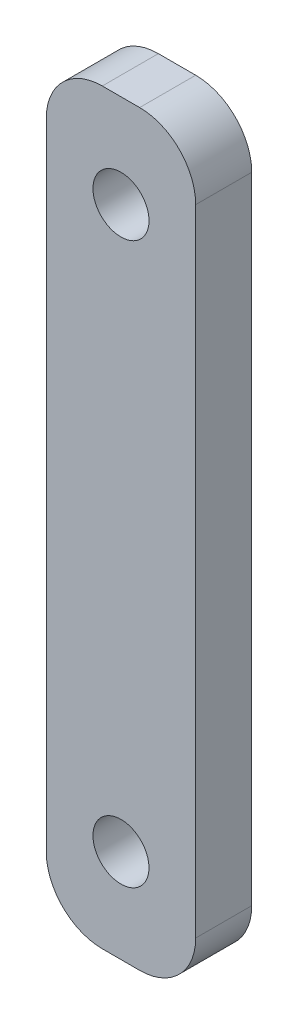
ISO-10303-21;
HEADER;
FILE_DESCRIPTION(('STEP AP214'),'2;1');
FILE_NAME('part.step','',(''),(''),'','','');
FILE_SCHEMA(('AUTOMOTIVE_DESIGN { 1 0 10303 214 1 1 1 1 }'));
ENDSEC;
DATA;
#1=APPLICATION_CONTEXT('core data for automotive mechanical design processes');
#2=APPLICATION_PROTOCOL_DEFINITION('international standard','automotive_design',2000,#1);
#3=PRODUCT_CONTEXT('',#1,'mechanical');
#4=PRODUCT('Part','Part','',(#3));
#5=PRODUCT_RELATED_PRODUCT_CATEGORY('part','',(#4));
#6=PRODUCT_DEFINITION_FORMATION('','',#4);
#7=PRODUCT_DEFINITION_CONTEXT('part definition',#1,'design');
#8=PRODUCT_DEFINITION('design','',#6,#7);
#9=PRODUCT_DEFINITION_SHAPE('','',#8);
#10=(LENGTH_UNIT() NAMED_UNIT(*) SI_UNIT(.MILLI.,.METRE.));
#11=(NAMED_UNIT(*) PLANE_ANGLE_UNIT() SI_UNIT($,.RADIAN.));
#12=(NAMED_UNIT(*) SI_UNIT($,.STERADIAN.) SOLID_ANGLE_UNIT());
#13=UNCERTAINTY_MEASURE_WITH_UNIT(LENGTH_MEASURE(1.E-05),#10,'distance_accuracy_value','');
#14=(GEOMETRIC_REPRESENTATION_CONTEXT(3) GLOBAL_UNCERTAINTY_ASSIGNED_CONTEXT((#13)) GLOBAL_UNIT_ASSIGNED_CONTEXT((#10,
#11,#12)) REPRESENTATION_CONTEXT('',''));
#15=CARTESIAN_POINT('',(0.,0.,0.));
#16=DIRECTION('',(0.,0.,1.));
#17=DIRECTION('',(1.,0.,0.));
#18=AXIS2_PLACEMENT_3D('',#15,#16,#17);
#19=CARTESIAN_POINT('',(0.999999999999999,-17.,1.5));
#20=DIRECTION('',(0.,0.,1.));
#21=DIRECTION('',(1.,0.,0.));
#22=AXIS2_PLACEMENT_3D('',#19,#20,#21);
#23=PLANE('',#22);
#24=CARTESIAN_POINT('',(0.,15.,1.5));
#25=DIRECTION('',(0.,0.,1.));
#26=DIRECTION('',(1.,0.,0.));
#27=AXIS2_PLACEMENT_3D('',#24,#25,#26);
#28=CIRCLE('',#27,1.5);
#29=CARTESIAN_POINT('',(1.5,15.,1.5));
#30=VERTEX_POINT('',#29);
#31=EDGE_CURVE('E146',#30,#30,#28,.T.);
#32=ORIENTED_EDGE('',*,*,#31,.F.);
#33=EDGE_LOOP('',(#32));
#34=FACE_BOUND('',#33,.T.);
#35=CARTESIAN_POINT('',(0.999999999999999,-17.,1.5));
#36=DIRECTION('',(0.,0.,1.));
#37=DIRECTION('',(1.,0.,0.));
#38=AXIS2_PLACEMENT_3D('',#35,#36,#37);
#39=CIRCLE('',#38,3.);
#40=CARTESIAN_POINT('',(0.999999999999999,-20.,1.5));
#41=VERTEX_POINT('',#40);
#42=CARTESIAN_POINT('',(4.,-17.,1.5));
#43=VERTEX_POINT('',#42);
#44=EDGE_CURVE('E164',#41,#43,#39,.T.);
#45=ORIENTED_EDGE('',*,*,#44,.T.);
#46=DIRECTION('',(0.,1.,0.));
#47=VECTOR('',#46,1.);
#48=CARTESIAN_POINT('',(4.,-17.,1.5));
#49=LINE('',#48,#47);
#50=CARTESIAN_POINT('',(4.,17.,1.5));
#51=VERTEX_POINT('',#50);
#52=EDGE_CURVE('E100',#43,#51,#49,.T.);
#53=ORIENTED_EDGE('',*,*,#52,.T.);
#54=CARTESIAN_POINT('',(0.999999999999999,17.,1.5));
#55=DIRECTION('',(0.,0.,1.));
#56=DIRECTION('',(-1.,0.,0.));
#57=AXIS2_PLACEMENT_3D('',#54,#55,#56);
#58=CIRCLE('',#57,3.);
#59=CARTESIAN_POINT('',(0.999999999999999,20.,1.5));
#60=VERTEX_POINT('',#59);
#61=EDGE_CURVE('E185',#51,#60,#58,.T.);
#62=ORIENTED_EDGE('',*,*,#61,.T.);
#63=DIRECTION('',(-1.,0.,0.));
#64=VECTOR('',#63,1.);
#65=CARTESIAN_POINT('',(-1.,20.,1.5));
#66=LINE('',#65,#64);
#67=CARTESIAN_POINT('',(-1.,20.,1.5));
#68=VERTEX_POINT('',#67);
#69=EDGE_CURVE('E199',#60,#68,#66,.T.);
#70=ORIENTED_EDGE('',*,*,#69,.T.);
#71=CARTESIAN_POINT('',(-1.,17.,1.5));
#72=DIRECTION('',(0.,0.,1.));
#73=DIRECTION('',(-1.,0.,0.));
#74=AXIS2_PLACEMENT_3D('',#71,#72,#73);
#75=CIRCLE('',#74,3.);
#76=CARTESIAN_POINT('',(-4.,17.,1.5));
#77=VERTEX_POINT('',#76);
#78=EDGE_CURVE('E119',#68,#77,#75,.T.);
#79=ORIENTED_EDGE('',*,*,#78,.T.);
#80=DIRECTION('',(0.,-1.,0.));
#81=VECTOR('',#80,1.);
#82=CARTESIAN_POINT('',(-4.,-17.,1.5));
#83=LINE('',#82,#81);
#84=CARTESIAN_POINT('',(-4.,-17.,1.5));
#85=VERTEX_POINT('',#84);
#86=EDGE_CURVE('E113',#77,#85,#83,.T.);
#87=ORIENTED_EDGE('',*,*,#86,.T.);
#88=CARTESIAN_POINT('',(-1.,-17.,1.5));
#89=DIRECTION('',(0.,0.,1.));
#90=DIRECTION('',(-1.,0.,0.));
#91=AXIS2_PLACEMENT_3D('',#88,#89,#90);
#92=CIRCLE('',#91,3.);
#93=CARTESIAN_POINT('',(-1.,-20.,1.5));
#94=VERTEX_POINT('',#93);
#95=EDGE_CURVE('E117',#85,#94,#92,.T.);
#96=ORIENTED_EDGE('',*,*,#95,.T.);
#97=DIRECTION('',(1.,0.,0.));
#98=VECTOR('',#97,1.);
#99=CARTESIAN_POINT('',(-1.,-20.,1.5));
#100=LINE('',#99,#98);
#101=EDGE_CURVE('E57',#94,#41,#100,.T.);
#102=ORIENTED_EDGE('',*,*,#101,.T.);
#103=EDGE_LOOP('',(#45,#53,#62,#70,#79,#87,#96,#102));
#104=FACE_BOUND('',#103,.T.);
#105=CARTESIAN_POINT('',(0.,-15.,1.5));
#106=DIRECTION('',(0.,0.,1.));
#107=DIRECTION('',(-1.,0.,0.));
#108=AXIS2_PLACEMENT_3D('',#105,#106,#107);
#109=CIRCLE('',#108,1.5);
#110=CARTESIAN_POINT('',(-1.5,-15.,1.5));
#111=VERTEX_POINT('',#110);
#112=EDGE_CURVE('E213',#111,#111,#109,.T.);
#113=ORIENTED_EDGE('',*,*,#112,.F.);
#114=EDGE_LOOP('',(#113));
#115=FACE_BOUND('',#114,.T.);
#116=ADVANCED_FACE('F39',(#34,#104,#115),#23,.T.);
#117=CARTESIAN_POINT('',(0.999999999999999,-17.,-1.5));
#118=DIRECTION('',(0.,0.,1.));
#119=DIRECTION('',(1.,0.,0.));
#120=AXIS2_PLACEMENT_3D('',#117,#118,#119);
#121=PLANE('',#120);
#122=CARTESIAN_POINT('',(0.999999999999999,-17.,-1.5));
#123=DIRECTION('',(0.,0.,1.));
#124=DIRECTION('',(1.,0.,0.));
#125=AXIS2_PLACEMENT_3D('',#122,#123,#124);
#126=CIRCLE('',#125,3.);
#127=CARTESIAN_POINT('',(0.999999999999999,-20.,-1.5));
#128=VERTEX_POINT('',#127);
#129=CARTESIAN_POINT('',(4.,-17.,-1.5));
#130=VERTEX_POINT('',#129);
#131=EDGE_CURVE('E141',#128,#130,#126,.T.);
#132=ORIENTED_EDGE('',*,*,#131,.F.);
#133=DIRECTION('',(1.,0.,0.));
#134=VECTOR('',#133,1.);
#135=CARTESIAN_POINT('',(-1.,-20.,-1.5));
#136=LINE('',#135,#134);
#137=CARTESIAN_POINT('',(-1.,-20.,-1.5));
#138=VERTEX_POINT('',#137);
#139=EDGE_CURVE('E92',#138,#128,#136,.T.);
#140=ORIENTED_EDGE('',*,*,#139,.F.);
#141=CARTESIAN_POINT('',(-1.,-17.,-1.5));
#142=DIRECTION('',(0.,0.,1.));
#143=DIRECTION('',(-1.,0.,0.));
#144=AXIS2_PLACEMENT_3D('',#141,#142,#143);
#145=CIRCLE('',#144,3.);
#146=CARTESIAN_POINT('',(-4.,-17.,-1.5));
#147=VERTEX_POINT('',#146);
#148=EDGE_CURVE('E86',#147,#138,#145,.T.);
#149=ORIENTED_EDGE('',*,*,#148,.F.);
#150=DIRECTION('',(0.,-1.,0.));
#151=VECTOR('',#150,1.);
#152=CARTESIAN_POINT('',(-4.,-17.,-1.5));
#153=LINE('',#152,#151);
#154=CARTESIAN_POINT('',(-4.,17.,-1.5));
#155=VERTEX_POINT('',#154);
#156=EDGE_CURVE('E128',#155,#147,#153,.T.);
#157=ORIENTED_EDGE('',*,*,#156,.F.);
#158=CARTESIAN_POINT('',(-1.,17.,-1.5));
#159=DIRECTION('',(0.,0.,1.));
#160=DIRECTION('',(-1.,0.,0.));
#161=AXIS2_PLACEMENT_3D('',#158,#159,#160);
#162=CIRCLE('',#161,3.);
#163=CARTESIAN_POINT('',(-1.,20.,-1.5));
#164=VERTEX_POINT('',#163);
#165=EDGE_CURVE('E155',#164,#155,#162,.T.);
#166=ORIENTED_EDGE('',*,*,#165,.F.);
#167=DIRECTION('',(-1.,0.,0.));
#168=VECTOR('',#167,1.);
#169=CARTESIAN_POINT('',(-1.,20.,-1.5));
#170=LINE('',#169,#168);
#171=CARTESIAN_POINT('',(0.999999999999999,20.,-1.5));
#172=VERTEX_POINT('',#171);
#173=EDGE_CURVE('E152',#172,#164,#170,.T.);
#174=ORIENTED_EDGE('',*,*,#173,.F.);
#175=CARTESIAN_POINT('',(0.999999999999999,17.,-1.5));
#176=DIRECTION('',(0.,0.,1.));
#177=DIRECTION('',(-1.,0.,0.));
#178=AXIS2_PLACEMENT_3D('',#175,#176,#177);
#179=CIRCLE('',#178,3.);
#180=CARTESIAN_POINT('',(4.,17.,-1.5));
#181=VERTEX_POINT('',#180);
#182=EDGE_CURVE('E149',#181,#172,#179,.T.);
#183=ORIENTED_EDGE('',*,*,#182,.F.);
#184=DIRECTION('',(0.,1.,0.));
#185=VECTOR('',#184,1.);
#186=CARTESIAN_POINT('',(4.,-17.,-1.5));
#187=LINE('',#186,#185);
#188=EDGE_CURVE('E145',#130,#181,#187,.T.);
#189=ORIENTED_EDGE('',*,*,#188,.F.);
#190=EDGE_LOOP('',(#132,#140,#149,#157,#166,#174,#183,#189));
#191=FACE_BOUND('',#190,.T.);
#192=CARTESIAN_POINT('',(0.,15.,-1.5));
#193=DIRECTION('',(0.,0.,1.));
#194=DIRECTION('',(1.,0.,0.));
#195=AXIS2_PLACEMENT_3D('',#192,#193,#194);
#196=CIRCLE('',#195,1.5);
#197=CARTESIAN_POINT('',(1.5,15.,-1.5));
#198=VERTEX_POINT('',#197);
#199=EDGE_CURVE('E209',#198,#198,#196,.T.);
#200=ORIENTED_EDGE('',*,*,#199,.T.);
#201=EDGE_LOOP('',(#200));
#202=FACE_BOUND('',#201,.T.);
#203=CARTESIAN_POINT('',(0.,-15.,-1.5));
#204=DIRECTION('',(0.,0.,1.));
#205=DIRECTION('',(-1.,0.,0.));
#206=AXIS2_PLACEMENT_3D('',#203,#204,#205);
#207=CIRCLE('',#206,1.5);
#208=CARTESIAN_POINT('',(-1.5,-15.,-1.5));
#209=VERTEX_POINT('',#208);
#210=EDGE_CURVE('E217',#209,#209,#207,.T.);
#211=ORIENTED_EDGE('',*,*,#210,.T.);
#212=EDGE_LOOP('',(#211));
#213=FACE_BOUND('',#212,.T.);
#214=ADVANCED_FACE('F189',(#191,#202,#213),#121,.F.);
#215=CARTESIAN_POINT('',(0.999999999999999,-17.,1.5));
#216=DIRECTION('',(0.,0.,-1.));
#217=DIRECTION('',(-1.,0.,0.));
#218=AXIS2_PLACEMENT_3D('',#215,#216,#217);
#219=CYLINDRICAL_SURFACE('',#218,3.);
#220=ORIENTED_EDGE('',*,*,#131,.T.);
#221=DIRECTION('',(0.,0.,-1.));
#222=VECTOR('',#221,1.);
#223=CARTESIAN_POINT('',(4.,-17.,1.5));
#224=LINE('',#223,#222);
#225=EDGE_CURVE('E11',#43,#130,#224,.T.);
#226=ORIENTED_EDGE('',*,*,#225,.F.);
#227=ORIENTED_EDGE('',*,*,#44,.F.);
#228=DIRECTION('',(0.,0.,-1.));
#229=VECTOR('',#228,1.);
#230=CARTESIAN_POINT('',(0.999999999999999,-20.,1.5));
#231=LINE('',#230,#229);
#232=EDGE_CURVE('E137',#41,#128,#231,.T.);
#233=ORIENTED_EDGE('',*,*,#232,.T.);
#234=EDGE_LOOP('',(#220,#226,#227,#233));
#235=FACE_BOUND('',#234,.T.);
#236=ADVANCED_FACE('F41',(#235),#219,.T.);
#237=CARTESIAN_POINT('',(4.,-17.,1.5));
#238=DIRECTION('',(-1.,0.,0.));
#239=DIRECTION('',(0.,0.,1.));
#240=AXIS2_PLACEMENT_3D('',#237,#238,#239);
#241=PLANE('',#240);
#242=ORIENTED_EDGE('',*,*,#188,.T.);
#243=DIRECTION('',(0.,0.,-1.));
#244=VECTOR('',#243,1.);
#245=CARTESIAN_POINT('',(4.,17.,1.5));
#246=LINE('',#245,#244);
#247=EDGE_CURVE('E49',#51,#181,#246,.T.);
#248=ORIENTED_EDGE('',*,*,#247,.F.);
#249=ORIENTED_EDGE('',*,*,#52,.F.);
#250=ORIENTED_EDGE('',*,*,#225,.T.);
#251=EDGE_LOOP('',(#242,#248,#249,#250));
#252=FACE_BOUND('',#251,.T.);
#253=ADVANCED_FACE('F251',(#252),#241,.F.);
#254=CARTESIAN_POINT('',(0.999999999999999,17.,1.5));
#255=DIRECTION('',(0.,0.,-1.));
#256=DIRECTION('',(-1.,0.,0.));
#257=AXIS2_PLACEMENT_3D('',#254,#255,#256);
#258=CYLINDRICAL_SURFACE('',#257,3.);
#259=ORIENTED_EDGE('',*,*,#182,.T.);
#260=DIRECTION('',(0.,0.,-1.));
#261=VECTOR('',#260,1.);
#262=CARTESIAN_POINT('',(0.999999999999999,20.,1.5));
#263=LINE('',#262,#261);
#264=EDGE_CURVE('E175',#60,#172,#263,.T.);
#265=ORIENTED_EDGE('',*,*,#264,.F.);
#266=ORIENTED_EDGE('',*,*,#61,.F.);
#267=ORIENTED_EDGE('',*,*,#247,.T.);
#268=EDGE_LOOP('',(#259,#265,#266,#267));
#269=FACE_BOUND('',#268,.T.);
#270=ADVANCED_FACE('F183',(#269),#258,.T.);
#271=CARTESIAN_POINT('',(-1.,20.,1.5));
#272=DIRECTION('',(0.,-1.,0.));
#273=DIRECTION('',(0.,0.,-1.));
#274=AXIS2_PLACEMENT_3D('',#271,#272,#273);
#275=PLANE('',#274);
#276=ORIENTED_EDGE('',*,*,#173,.T.);
#277=DIRECTION('',(0.,0.,-1.));
#278=VECTOR('',#277,1.);
#279=CARTESIAN_POINT('',(-1.,20.,1.5));
#280=LINE('',#279,#278);
#281=EDGE_CURVE('E171',#68,#164,#280,.T.);
#282=ORIENTED_EDGE('',*,*,#281,.F.);
#283=ORIENTED_EDGE('',*,*,#69,.F.);
#284=ORIENTED_EDGE('',*,*,#264,.T.);
#285=EDGE_LOOP('',(#276,#282,#283,#284));
#286=FACE_BOUND('',#285,.T.);
#287=ADVANCED_FACE('F194',(#286),#275,.F.);
#288=CARTESIAN_POINT('',(-1.,17.,1.5));
#289=DIRECTION('',(0.,0.,-1.));
#290=DIRECTION('',(-1.,0.,0.));
#291=AXIS2_PLACEMENT_3D('',#288,#289,#290);
#292=CYLINDRICAL_SURFACE('',#291,3.);
#293=ORIENTED_EDGE('',*,*,#165,.T.);
#294=DIRECTION('',(0.,0.,-1.));
#295=VECTOR('',#294,1.);
#296=CARTESIAN_POINT('',(-4.,17.,1.5));
#297=LINE('',#296,#295);
#298=EDGE_CURVE('E130',#77,#155,#297,.T.);
#299=ORIENTED_EDGE('',*,*,#298,.F.);
#300=ORIENTED_EDGE('',*,*,#78,.F.);
#301=ORIENTED_EDGE('',*,*,#281,.T.);
#302=EDGE_LOOP('',(#293,#299,#300,#301));
#303=FACE_BOUND('',#302,.T.);
#304=ADVANCED_FACE('F197',(#303),#292,.T.);
#305=CARTESIAN_POINT('',(-4.,-17.,1.5));
#306=DIRECTION('',(1.,0.,0.));
#307=DIRECTION('',(0.,0.,-1.));
#308=AXIS2_PLACEMENT_3D('',#305,#306,#307);
#309=PLANE('',#308);
#310=ORIENTED_EDGE('',*,*,#156,.T.);
#311=DIRECTION('',(0.,0.,-1.));
#312=VECTOR('',#311,1.);
#313=CARTESIAN_POINT('',(-4.,-17.,1.5));
#314=LINE('',#313,#312);
#315=EDGE_CURVE('E125',#85,#147,#314,.T.);
#316=ORIENTED_EDGE('',*,*,#315,.F.);
#317=ORIENTED_EDGE('',*,*,#86,.F.);
#318=ORIENTED_EDGE('',*,*,#298,.T.);
#319=EDGE_LOOP('',(#310,#316,#317,#318));
#320=FACE_BOUND('',#319,.T.);
#321=ADVANCED_FACE('F126',(#320),#309,.F.);
#322=CARTESIAN_POINT('',(-1.,-17.,1.5));
#323=DIRECTION('',(0.,0.,-1.));
#324=DIRECTION('',(-1.,0.,0.));
#325=AXIS2_PLACEMENT_3D('',#322,#323,#324);
#326=CYLINDRICAL_SURFACE('',#325,3.);
#327=ORIENTED_EDGE('',*,*,#148,.T.);
#328=DIRECTION('',(0.,0.,-1.));
#329=VECTOR('',#328,1.);
#330=CARTESIAN_POINT('',(-1.,-20.,1.5));
#331=LINE('',#330,#329);
#332=EDGE_CURVE('E131',#94,#138,#331,.T.);
#333=ORIENTED_EDGE('',*,*,#332,.F.);
#334=ORIENTED_EDGE('',*,*,#95,.F.);
#335=ORIENTED_EDGE('',*,*,#315,.T.);
#336=EDGE_LOOP('',(#327,#333,#334,#335));
#337=FACE_BOUND('',#336,.T.);
#338=ADVANCED_FACE('F133',(#337),#326,.T.);
#339=CARTESIAN_POINT('',(-1.,-20.,1.5));
#340=DIRECTION('',(0.,1.,0.));
#341=DIRECTION('',(0.,0.,1.));
#342=AXIS2_PLACEMENT_3D('',#339,#340,#341);
#343=PLANE('',#342);
#344=ORIENTED_EDGE('',*,*,#139,.T.);
#345=ORIENTED_EDGE('',*,*,#232,.F.);
#346=ORIENTED_EDGE('',*,*,#101,.F.);
#347=ORIENTED_EDGE('',*,*,#332,.T.);
#348=EDGE_LOOP('',(#344,#345,#346,#347));
#349=FACE_BOUND('',#348,.T.);
#350=ADVANCED_FACE('F239',(#349),#343,.F.);
#351=CARTESIAN_POINT('',(0.,15.,1.5));
#352=DIRECTION('',(0.,0.,-1.));
#353=DIRECTION('',(-1.,0.,0.));
#354=AXIS2_PLACEMENT_3D('',#351,#352,#353);
#355=CYLINDRICAL_SURFACE('',#354,1.5);
#356=ORIENTED_EDGE('',*,*,#31,.T.);
#357=EDGE_LOOP('',(#356));
#358=FACE_BOUND('',#357,.T.);
#359=ORIENTED_EDGE('',*,*,#199,.F.);
#360=EDGE_LOOP('',(#359));
#361=FACE_BOUND('',#360,.T.);
#362=ADVANCED_FACE('F236',(#358,#361),#355,.F.);
#363=CARTESIAN_POINT('',(0.,-15.,1.5));
#364=DIRECTION('',(0.,0.,-1.));
#365=DIRECTION('',(-1.,0.,0.));
#366=AXIS2_PLACEMENT_3D('',#363,#364,#365);
#367=CYLINDRICAL_SURFACE('',#366,1.5);
#368=ORIENTED_EDGE('',*,*,#112,.T.);
#369=EDGE_LOOP('',(#368));
#370=FACE_BOUND('',#369,.T.);
#371=ORIENTED_EDGE('',*,*,#210,.F.);
#372=EDGE_LOOP('',(#371));
#373=FACE_BOUND('',#372,.T.);
#374=ADVANCED_FACE('F225',(#370,#373),#367,.F.);
#375=CLOSED_SHELL('',(#116,#214,#236,#253,#270,#287,#304,#321,#338,#350,#362,#374));
#376=MANIFOLD_SOLID_BREP('B2',#375);
#377=ADVANCED_BREP_SHAPE_REPRESENTATION('',(#18,#376),#14);
#378=SHAPE_DEFINITION_REPRESENTATION(#9,#377);
ENDSEC;
END-ISO-10303-21;
